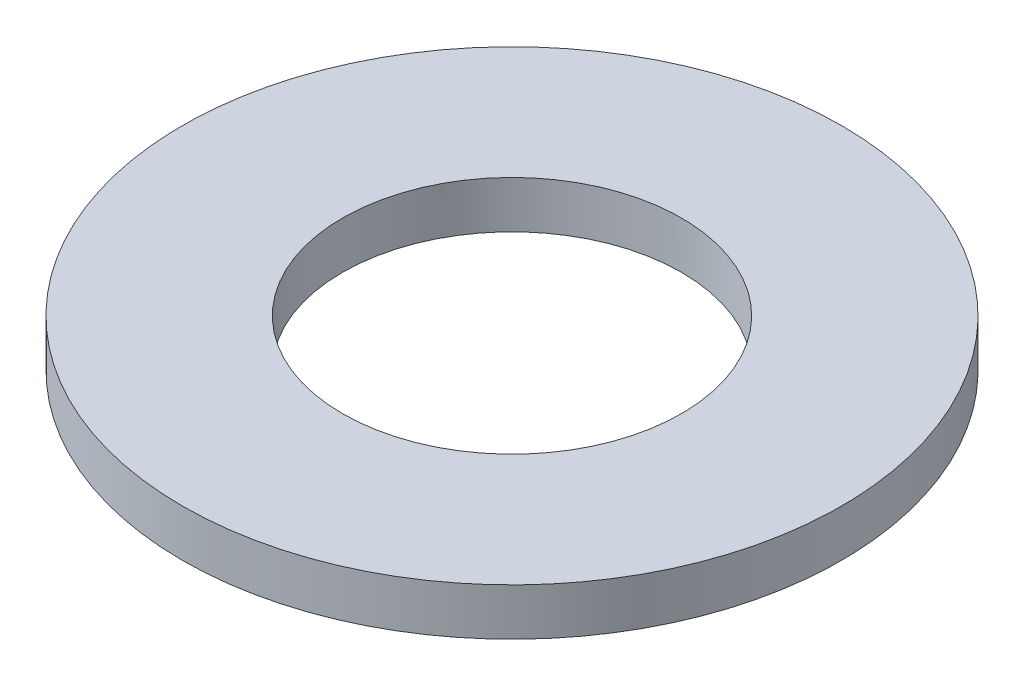
ISO-10303-21;
HEADER;
FILE_DESCRIPTION(('STEP AP214'),'2;1');
FILE_NAME('part.step','',(''),(''),'','','');
FILE_SCHEMA(('AUTOMOTIVE_DESIGN { 1 0 10303 214 1 1 1 1 }'));
ENDSEC;
DATA;
#1=APPLICATION_CONTEXT('core data for automotive mechanical design processes');
#2=APPLICATION_PROTOCOL_DEFINITION('international standard','automotive_design',2000,#1);
#3=PRODUCT_CONTEXT('',#1,'mechanical');
#4=PRODUCT('Part','Part','',(#3));
#5=PRODUCT_RELATED_PRODUCT_CATEGORY('part','',(#4));
#6=PRODUCT_DEFINITION_FORMATION('','',#4);
#7=PRODUCT_DEFINITION_CONTEXT('part definition',#1,'design');
#8=PRODUCT_DEFINITION('design','',#6,#7);
#9=PRODUCT_DEFINITION_SHAPE('','',#8);
#10=(LENGTH_UNIT() NAMED_UNIT(*) SI_UNIT(.MILLI.,.METRE.));
#11=(NAMED_UNIT(*) PLANE_ANGLE_UNIT() SI_UNIT($,.RADIAN.));
#12=(NAMED_UNIT(*) SI_UNIT($,.STERADIAN.) SOLID_ANGLE_UNIT());
#13=UNCERTAINTY_MEASURE_WITH_UNIT(LENGTH_MEASURE(1.E-05),#10,'distance_accuracy_value','');
#14=(GEOMETRIC_REPRESENTATION_CONTEXT(3) GLOBAL_UNCERTAINTY_ASSIGNED_CONTEXT((#13)) GLOBAL_UNIT_ASSIGNED_CONTEXT((#10,
#11,#12)) REPRESENTATION_CONTEXT('',''));
#15=CARTESIAN_POINT('',(0.,0.,0.));
#16=DIRECTION('',(0.,0.,1.));
#17=DIRECTION('',(1.,0.,0.));
#18=AXIS2_PLACEMENT_3D('',#15,#16,#17);
#19=CARTESIAN_POINT('',(0.,490.,0.));
#20=DIRECTION('',(0.,-1.,0.));
#21=DIRECTION('',(0.,0.,-1.));
#22=AXIS2_PLACEMENT_3D('',#19,#20,#21);
#23=CYLINDRICAL_SURFACE('',#22,1700.);
#24=CARTESIAN_POINT('',(0.,490.,0.));
#25=DIRECTION('',(0.,-1.,0.));
#26=DIRECTION('',(0.,0.,-1.));
#27=AXIS2_PLACEMENT_3D('',#24,#25,#26);
#28=CIRCLE('',#27,1700.);
#29=CARTESIAN_POINT('',(0.,490.,-1700.));
#30=VERTEX_POINT('',#29);
#31=EDGE_CURVE('E51',#30,#30,#28,.T.);
#32=ORIENTED_EDGE('',*,*,#31,.F.);
#33=EDGE_LOOP('',(#32));
#34=FACE_BOUND('',#33,.T.);
#35=CARTESIAN_POINT('',(0.,250.,0.));
#36=DIRECTION('',(0.,-1.,0.));
#37=DIRECTION('',(0.,0.,-1.));
#38=AXIS2_PLACEMENT_3D('',#35,#36,#37);
#39=CIRCLE('',#38,1700.);
#40=CARTESIAN_POINT('',(0.,250.,-1700.));
#41=VERTEX_POINT('',#40);
#42=EDGE_CURVE('E69',#41,#41,#39,.F.);
#43=ORIENTED_EDGE('',*,*,#42,.F.);
#44=EDGE_LOOP('',(#43));
#45=FACE_BOUND('',#44,.T.);
#46=ADVANCED_FACE('F37',(#34,#45),#23,.F.);
#47=CARTESIAN_POINT('',(0.,490.,0.));
#48=DIRECTION('',(0.,-1.,0.));
#49=DIRECTION('',(0.,0.,-1.));
#50=AXIS2_PLACEMENT_3D('',#47,#48,#49);
#51=PLANE('',#50);
#52=CARTESIAN_POINT('',(0.,490.,0.));
#53=DIRECTION('',(0.,-1.,0.));
#54=DIRECTION('',(0.,0.,-1.));
#55=AXIS2_PLACEMENT_3D('',#52,#53,#54);
#56=CIRCLE('',#55,950.);
#57=CARTESIAN_POINT('',(0.,490.,-950.));
#58=VERTEX_POINT('',#57);
#59=EDGE_CURVE('E57',#58,#58,#56,.T.);
#60=ORIENTED_EDGE('',*,*,#59,.F.);
#61=EDGE_LOOP('',(#60));
#62=FACE_BOUND('',#61,.T.);
#63=ORIENTED_EDGE('',*,*,#31,.T.);
#64=EDGE_LOOP('',(#63));
#65=FACE_BOUND('',#64,.T.);
#66=ADVANCED_FACE('F100',(#62,#65),#51,.T.);
#67=CARTESIAN_POINT('',(0.,490.,0.));
#68=DIRECTION('',(0.,-1.,0.));
#69=DIRECTION('',(0.,0.,-1.));
#70=AXIS2_PLACEMENT_3D('',#67,#68,#69);
#71=CYLINDRICAL_SURFACE('',#70,950.);
#72=ORIENTED_EDGE('',*,*,#59,.T.);
#73=EDGE_LOOP('',(#72));
#74=FACE_BOUND('',#73,.T.);
#75=CARTESIAN_POINT('',(0.,250.,0.));
#76=DIRECTION('',(0.,-1.,0.));
#77=DIRECTION('',(0.,0.,-1.));
#78=AXIS2_PLACEMENT_3D('',#75,#76,#77);
#79=CIRCLE('',#78,950.);
#80=CARTESIAN_POINT('',(0.,250.,-950.));
#81=VERTEX_POINT('',#80);
#82=EDGE_CURVE('E41',#81,#81,#79,.F.);
#83=ORIENTED_EDGE('',*,*,#82,.T.);
#84=EDGE_LOOP('',(#83));
#85=FACE_BOUND('',#84,.T.);
#86=ADVANCED_FACE('F78',(#74,#85),#71,.T.);
#87=CARTESIAN_POINT('',(0.,250.,-1750.));
#88=DIRECTION('',(0.,-1.,0.));
#89=DIRECTION('',(0.,0.,-1.));
#90=AXIS2_PLACEMENT_3D('',#87,#88,#89);
#91=PLANE('',#90);
#92=ORIENTED_EDGE('',*,*,#82,.F.);
#93=EDGE_LOOP('',(#92));
#94=FACE_BOUND('',#93,.T.);
#95=CARTESIAN_POINT('',(0.,250.,0.));
#96=DIRECTION('',(0.,-1.,0.));
#97=DIRECTION('',(0.,0.,-1.));
#98=AXIS2_PLACEMENT_3D('',#95,#96,#97);
#99=CIRCLE('',#98,900.);
#100=CARTESIAN_POINT('',(0.,250.,-900.));
#101=VERTEX_POINT('',#100);
#102=EDGE_CURVE('E65',#101,#101,#99,.F.);
#103=ORIENTED_EDGE('',*,*,#102,.T.);
#104=EDGE_LOOP('',(#103));
#105=FACE_BOUND('',#104,.T.);
#106=ADVANCED_FACE('F80',(#94,#105),#91,.T.);
#107=ORIENTED_EDGE('',*,*,#42,.T.);
#108=EDGE_LOOP('',(#107));
#109=FACE_BOUND('',#108,.T.);
#110=CARTESIAN_POINT('',(0.,250.,0.));
#111=DIRECTION('',(0.,-1.,0.));
#112=DIRECTION('',(0.,0.,-1.));
#113=AXIS2_PLACEMENT_3D('',#110,#111,#112);
#114=CIRCLE('',#113,1750.);
#115=CARTESIAN_POINT('',(0.,250.,-1750.));
#116=VERTEX_POINT('',#115);
#117=EDGE_CURVE('E61',#116,#116,#114,.T.);
#118=ORIENTED_EDGE('',*,*,#117,.T.);
#119=EDGE_LOOP('',(#118));
#120=FACE_BOUND('',#119,.T.);
#121=ADVANCED_FACE('F83',(#109,#120),#91,.T.);
#122=CARTESIAN_POINT('',(0.,500.,0.));
#123=DIRECTION('',(0.,-1.,0.));
#124=DIRECTION('',(0.,0.,-1.));
#125=AXIS2_PLACEMENT_3D('',#122,#123,#124);
#126=CYLINDRICAL_SURFACE('',#125,1750.);
#127=CARTESIAN_POINT('',(0.,500.,0.));
#128=DIRECTION('',(0.,1.,0.));
#129=DIRECTION('',(0.,0.,1.));
#130=AXIS2_PLACEMENT_3D('',#127,#128,#129);
#131=CIRCLE('',#130,1750.);
#132=CARTESIAN_POINT('',(0.,500.,1750.));
#133=VERTEX_POINT('',#132);
#134=EDGE_CURVE('E10',#133,#133,#131,.T.);
#135=ORIENTED_EDGE('',*,*,#134,.F.);
#136=EDGE_LOOP('',(#135));
#137=FACE_BOUND('',#136,.T.);
#138=ORIENTED_EDGE('',*,*,#117,.F.);
#139=EDGE_LOOP('',(#138));
#140=FACE_BOUND('',#139,.T.);
#141=ADVANCED_FACE('F39',(#137,#140),#126,.T.);
#142=CARTESIAN_POINT('',(0.,200.,0.));
#143=DIRECTION('',(0.,1.,0.));
#144=DIRECTION('',(0.,0.,1.));
#145=AXIS2_PLACEMENT_3D('',#142,#143,#144);
#146=CYLINDRICAL_SURFACE('',#145,900.);
#147=CARTESIAN_POINT('',(0.,500.,0.));
#148=DIRECTION('',(0.,1.,0.));
#149=DIRECTION('',(0.,0.,1.));
#150=AXIS2_PLACEMENT_3D('',#147,#148,#149);
#151=CIRCLE('',#150,900.);
#152=CARTESIAN_POINT('',(0.,500.,900.));
#153=VERTEX_POINT('',#152);
#154=EDGE_CURVE('E46',#153,#153,#151,.T.);
#155=ORIENTED_EDGE('',*,*,#154,.T.);
#156=EDGE_LOOP('',(#155));
#157=FACE_BOUND('',#156,.T.);
#158=ORIENTED_EDGE('',*,*,#102,.F.);
#159=EDGE_LOOP('',(#158));
#160=FACE_BOUND('',#159,.T.);
#161=ADVANCED_FACE('F87',(#157,#160),#146,.F.);
#162=CARTESIAN_POINT('',(0.,500.,0.));
#163=DIRECTION('',(0.,1.,0.));
#164=DIRECTION('',(0.,0.,1.));
#165=AXIS2_PLACEMENT_3D('',#162,#163,#164);
#166=PLANE('',#165);
#167=ORIENTED_EDGE('',*,*,#154,.F.);
#168=EDGE_LOOP('',(#167));
#169=FACE_BOUND('',#168,.T.);
#170=ORIENTED_EDGE('',*,*,#134,.T.);
#171=EDGE_LOOP('',(#170));
#172=FACE_BOUND('',#171,.T.);
#173=ADVANCED_FACE('F89',(#169,#172),#166,.T.);
#174=CLOSED_SHELL('',(#46,#66,#86,#106,#121,#141,#161,#173));
#175=MANIFOLD_SOLID_BREP('B2',#174);
#176=ADVANCED_BREP_SHAPE_REPRESENTATION('',(#18,#175),#14);
#177=SHAPE_DEFINITION_REPRESENTATION(#9,#176);
ENDSEC;
END-ISO-10303-21;
